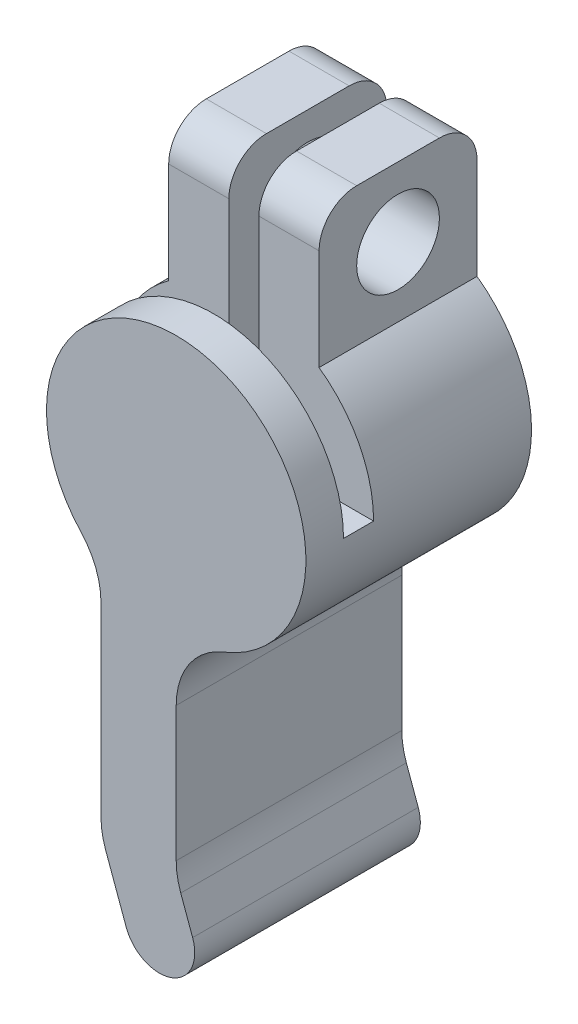
ISO-10303-21;
HEADER;
FILE_DESCRIPTION(('STEP AP214'),'2;1');
FILE_NAME('part.step','',(''),(''),'','','');
FILE_SCHEMA(('AUTOMOTIVE_DESIGN { 1 0 10303 214 1 1 1 1 }'));
ENDSEC;
DATA;
#1=APPLICATION_CONTEXT('core data for automotive mechanical design processes');
#2=APPLICATION_PROTOCOL_DEFINITION('international standard','automotive_design',2000,#1);
#3=PRODUCT_CONTEXT('',#1,'mechanical');
#4=PRODUCT('Part','Part','',(#3));
#5=PRODUCT_RELATED_PRODUCT_CATEGORY('part','',(#4));
#6=PRODUCT_DEFINITION_FORMATION('','',#4);
#7=PRODUCT_DEFINITION_CONTEXT('part definition',#1,'design');
#8=PRODUCT_DEFINITION('design','',#6,#7);
#9=PRODUCT_DEFINITION_SHAPE('','',#8);
#10=(LENGTH_UNIT() NAMED_UNIT(*) SI_UNIT(.MILLI.,.METRE.));
#11=(NAMED_UNIT(*) PLANE_ANGLE_UNIT() SI_UNIT($,.RADIAN.));
#12=(NAMED_UNIT(*) SI_UNIT($,.STERADIAN.) SOLID_ANGLE_UNIT());
#13=UNCERTAINTY_MEASURE_WITH_UNIT(LENGTH_MEASURE(1.E-05),#10,'distance_accuracy_value','');
#14=(GEOMETRIC_REPRESENTATION_CONTEXT(3) GLOBAL_UNCERTAINTY_ASSIGNED_CONTEXT((#13)) GLOBAL_UNIT_ASSIGNED_CONTEXT((#10,
#11,#12)) REPRESENTATION_CONTEXT('',''));
#15=CARTESIAN_POINT('',(0.,0.,0.));
#16=DIRECTION('',(0.,0.,1.));
#17=DIRECTION('',(1.,0.,0.));
#18=AXIS2_PLACEMENT_3D('',#15,#16,#17);
#19=CARTESIAN_POINT('',(0.,0.,4.2));
#20=DIRECTION('',(0.,0.,1.));
#21=DIRECTION('',(1.,0.,0.));
#22=AXIS2_PLACEMENT_3D('',#19,#20,#21);
#23=PLANE('',#22);
#24=DIRECTION('',(1.,0.,0.));
#25=VECTOR('',#24,1.);
#26=CARTESIAN_POINT('',(0.,0.,4.2));
#27=LINE('',#26,#25);
#28=CARTESIAN_POINT('',(1.45,0.,4.2));
#29=VERTEX_POINT('',#28);
#30=CARTESIAN_POINT('',(3.45,0.,4.2));
#31=VERTEX_POINT('',#30);
#32=EDGE_CURVE('E249',#29,#31,#27,.T.);
#33=ORIENTED_EDGE('',*,*,#32,.T.);
#34=CARTESIAN_POINT('',(0.,0.,4.2));
#35=DIRECTION('',(0.,0.,1.));
#36=DIRECTION('',(1.,0.,0.));
#37=AXIS2_PLACEMENT_3D('',#34,#35,#36);
#38=CIRCLE('',#37,3.45);
#39=CARTESIAN_POINT('',(2.,2.81113855937412,4.2));
#40=VERTEX_POINT('',#39);
#41=EDGE_CURVE('E294',#31,#40,#38,.T.);
#42=ORIENTED_EDGE('',*,*,#41,.T.);
#43=DIRECTION('',(0.,-1.,0.));
#44=VECTOR('',#43,1.);
#45=CARTESIAN_POINT('',(2.,0.,4.2));
#46=LINE('',#45,#44);
#47=CARTESIAN_POINT('',(2.,5.5,4.2));
#48=VERTEX_POINT('',#47);
#49=EDGE_CURVE('E296',#48,#40,#46,.T.);
#50=ORIENTED_EDGE('',*,*,#49,.F.);
#51=DIRECTION('',(1.,0.,0.));
#52=VECTOR('',#51,1.);
#53=CARTESIAN_POINT('',(0.,5.5,4.2));
#54=LINE('',#53,#52);
#55=CARTESIAN_POINT('',(0.4,5.5,4.2));
#56=VERTEX_POINT('',#55);
#57=EDGE_CURVE('E372',#48,#56,#54,.F.);
#58=ORIENTED_EDGE('',*,*,#57,.T.);
#59=DIRECTION('',(0.,1.,0.));
#60=VECTOR('',#59,1.);
#61=CARTESIAN_POINT('',(0.400000000000001,0.,4.2));
#62=LINE('',#61,#60);
#63=CARTESIAN_POINT('',(0.4,1.39373598647664,4.2));
#64=VERTEX_POINT('',#63);
#65=EDGE_CURVE('E299',#64,#56,#62,.T.);
#66=ORIENTED_EDGE('',*,*,#65,.F.);
#67=CARTESIAN_POINT('',(0.,0.,4.2));
#68=DIRECTION('',(0.,0.,1.));
#69=DIRECTION('',(1.,0.,0.));
#70=AXIS2_PLACEMENT_3D('',#67,#68,#69);
#71=CIRCLE('',#70,1.45);
#72=EDGE_CURVE('E302',#29,#64,#71,.T.);
#73=ORIENTED_EDGE('',*,*,#72,.F.);
#74=EDGE_LOOP('',(#33,#42,#50,#58,#66,#73));
#75=FACE_BOUND('',#74,.T.);
#76=ADVANCED_FACE('F42',(#75),#23,.T.);
#77=CARTESIAN_POINT('',(-2.,0.,4.2));
#78=DIRECTION('',(1.,0.,0.));
#79=DIRECTION('',(0.,1.,0.));
#80=AXIS2_PLACEMENT_3D('',#77,#78,#79);
#81=PLANE('',#80);
#82=CARTESIAN_POINT('',(-2.,4.65556927968706,2.1));
#83=DIRECTION('',(-1.,0.,0.));
#84=DIRECTION('',(0.,-1.,0.));
#85=AXIS2_PLACEMENT_3D('',#82,#83,#84);
#86=CIRCLE('',#85,1.1);
#87=CARTESIAN_POINT('',(-2.,3.55556927968706,2.1));
#88=VERTEX_POINT('',#87);
#89=EDGE_CURVE('E278',#88,#88,#86,.T.);
#90=ORIENTED_EDGE('',*,*,#89,.F.);
#91=EDGE_LOOP('',(#90));
#92=FACE_BOUND('',#91,.T.);
#93=DIRECTION('',(0.,-1.,0.));
#94=VECTOR('',#93,1.);
#95=CARTESIAN_POINT('',(-2.,0.,4.2));
#96=LINE('',#95,#94);
#97=CARTESIAN_POINT('',(-2.,5.5,4.2));
#98=VERTEX_POINT('',#97);
#99=CARTESIAN_POINT('',(-2.,2.81113855937412,4.2));
#100=VERTEX_POINT('',#99);
#101=EDGE_CURVE('E289',#98,#100,#96,.T.);
#102=ORIENTED_EDGE('',*,*,#101,.F.);
#103=CARTESIAN_POINT('',(-2.,5.5,3.2));
#104=DIRECTION('',(1.,0.,0.));
#105=DIRECTION('',(0.,1.,0.));
#106=AXIS2_PLACEMENT_3D('',#103,#104,#105);
#107=CIRCLE('',#106,1.);
#108=CARTESIAN_POINT('',(-2.,6.5,3.2));
#109=VERTEX_POINT('',#108);
#110=EDGE_CURVE('E385',#98,#109,#107,.F.);
#111=ORIENTED_EDGE('',*,*,#110,.T.);
#112=DIRECTION('',(0.,0.,-1.));
#113=VECTOR('',#112,1.);
#114=CARTESIAN_POINT('',(-2.,6.5,4.2));
#115=LINE('',#114,#113);
#116=CARTESIAN_POINT('',(-2.,6.5,1.));
#117=VERTEX_POINT('',#116);
#118=EDGE_CURVE('E309',#109,#117,#115,.T.);
#119=ORIENTED_EDGE('',*,*,#118,.T.);
#120=CARTESIAN_POINT('',(-2.,5.5,1.));
#121=DIRECTION('',(1.,0.,0.));
#122=DIRECTION('',(0.,1.,0.));
#123=AXIS2_PLACEMENT_3D('',#120,#121,#122);
#124=CIRCLE('',#123,1.);
#125=CARTESIAN_POINT('',(-2.,5.5,0.));
#126=VERTEX_POINT('',#125);
#127=EDGE_CURVE('E383',#117,#126,#124,.F.);
#128=ORIENTED_EDGE('',*,*,#127,.T.);
#129=DIRECTION('',(0.,-1.,0.));
#130=VECTOR('',#129,1.);
#131=CARTESIAN_POINT('',(-2.,0.,0.));
#132=LINE('',#131,#130);
#133=CARTESIAN_POINT('',(-2.,2.81113855937412,0.));
#134=VERTEX_POINT('',#133);
#135=EDGE_CURVE('E288',#126,#134,#132,.T.);
#136=ORIENTED_EDGE('',*,*,#135,.T.);
#137=DIRECTION('',(0.,0.,-1.));
#138=VECTOR('',#137,1.);
#139=CARTESIAN_POINT('',(-2.,2.81113855937412,4.2));
#140=LINE('',#139,#138);
#141=EDGE_CURVE('E237',#100,#134,#140,.T.);
#142=ORIENTED_EDGE('',*,*,#141,.F.);
#143=EDGE_LOOP('',(#102,#111,#119,#128,#136,#142));
#144=FACE_BOUND('',#143,.T.);
#145=ADVANCED_FACE('F506',(#92,#144),#81,.F.);
#146=CARTESIAN_POINT('',(-2.,0.,4.2));
#147=DIRECTION('',(-1.,0.,0.));
#148=DIRECTION('',(0.,0.,1.));
#149=AXIS2_PLACEMENT_3D('',#146,#147,#148);
#150=PLANE('',#149);
#151=DIRECTION('',(0.,1.,0.));
#152=VECTOR('',#151,1.);
#153=CARTESIAN_POINT('',(-2.,0.,0.));
#154=LINE('',#153,#152);
#155=CARTESIAN_POINT('',(-2.,-8.64734603858308,0.));
#156=VERTEX_POINT('',#155);
#157=CARTESIAN_POINT('',(-2.,-3.70168880377592,0.));
#158=VERTEX_POINT('',#157);
#159=EDGE_CURVE('E314',#156,#158,#154,.T.);
#160=ORIENTED_EDGE('',*,*,#159,.F.);
#161=DIRECTION('',(0.,0.,-1.));
#162=VECTOR('',#161,1.);
#163=CARTESIAN_POINT('',(-2.,-8.64734603858308,4.2));
#164=LINE('',#163,#162);
#165=CARTESIAN_POINT('',(-2.,-8.64734603858308,6.));
#166=VERTEX_POINT('',#165);
#167=EDGE_CURVE('E403',#156,#166,#164,.F.);
#168=ORIENTED_EDGE('',*,*,#167,.T.);
#169=DIRECTION('',(0.,-1.,0.));
#170=VECTOR('',#169,1.);
#171=CARTESIAN_POINT('',(-2.,0.,6.));
#172=LINE('',#171,#170);
#173=CARTESIAN_POINT('',(-2.,-3.70168880377592,6.));
#174=VERTEX_POINT('',#173);
#175=EDGE_CURVE('E227',#174,#166,#172,.T.);
#176=ORIENTED_EDGE('',*,*,#175,.F.);
#177=DIRECTION('',(0.,0.,-1.));
#178=VECTOR('',#177,1.);
#179=CARTESIAN_POINT('',(-2.,-3.70168880377592,4.2));
#180=LINE('',#179,#178);
#181=EDGE_CURVE('E400',#174,#158,#180,.T.);
#182=ORIENTED_EDGE('',*,*,#181,.T.);
#183=EDGE_LOOP('',(#160,#168,#176,#182));
#184=FACE_BOUND('',#183,.T.);
#185=ADVANCED_FACE('F440',(#184),#150,.T.);
#186=CARTESIAN_POINT('',(-4.65858868670837,-1.69558761565109,4.2));
#187=DIRECTION('',(-0.939692620785911,-0.342020143325663,0.));
#188=DIRECTION('',(0.342020143325663,-0.939692620785911,0.));
#189=AXIS2_PLACEMENT_3D('',#186,#187,#188);
#190=PLANE('',#189);
#191=DIRECTION('',(0.342020143325663,-0.939692620785911,0.));
#192=VECTOR('',#191,1.);
#193=CARTESIAN_POINT('',(-4.65858868670837,-1.69558761565109,6.));
#194=LINE('',#193,#192);
#195=CARTESIAN_POINT('',(-1.87938524157182,-9.3313863252344,6.));
#196=VERTEX_POINT('',#195);
#197=CARTESIAN_POINT('',(-1.32928016199955,-10.8427876096865,6.));
#198=VERTEX_POINT('',#197);
#199=EDGE_CURVE('E215',#196,#198,#194,.T.);
#200=ORIENTED_EDGE('',*,*,#199,.F.);
#201=DIRECTION('',(0.,0.,-1.));
#202=VECTOR('',#201,1.);
#203=CARTESIAN_POINT('',(-1.87938524157182,-9.3313863252344,4.2));
#204=LINE('',#203,#202);
#205=CARTESIAN_POINT('',(-1.87938524157182,-9.3313863252344,0.));
#206=VERTEX_POINT('',#205);
#207=EDGE_CURVE('E396',#196,#206,#204,.T.);
#208=ORIENTED_EDGE('',*,*,#207,.T.);
#209=DIRECTION('',(-0.342020143325663,0.939692620785911,0.));
#210=VECTOR('',#209,1.);
#211=CARTESIAN_POINT('',(-4.65858868670837,-1.69558761565109,0.));
#212=LINE('',#211,#210);
#213=CARTESIAN_POINT('',(-1.32928016199955,-10.8427876096865,0.));
#214=VERTEX_POINT('',#213);
#215=EDGE_CURVE('E233',#214,#206,#212,.T.);
#216=ORIENTED_EDGE('',*,*,#215,.F.);
#217=DIRECTION('',(0.,0.,-1.));
#218=VECTOR('',#217,1.);
#219=CARTESIAN_POINT('',(-1.32928016199955,-10.8427876096865,4.2));
#220=LINE('',#219,#218);
#221=EDGE_CURVE('E230',#198,#214,#220,.T.);
#222=ORIENTED_EDGE('',*,*,#221,.F.);
#223=EDGE_LOOP('',(#200,#208,#216,#222));
#224=FACE_BOUND('',#223,.T.);
#225=ADVANCED_FACE('F231',(#224),#190,.T.);
#226=CARTESIAN_POINT('',(-0.446257940440058,-10.5213938048433,4.2));
#227=DIRECTION('',(0.,0.,-1.));
#228=DIRECTION('',(-1.,0.,0.));
#229=AXIS2_PLACEMENT_3D('',#226,#227,#228);
#230=CYLINDRICAL_SURFACE('',#229,0.939692620785911);
#231=CARTESIAN_POINT('',(-0.446257940440058,-10.5213938048433,0.));
#232=DIRECTION('',(0.,0.,1.));
#233=DIRECTION('',(1.,0.,0.));
#234=AXIS2_PLACEMENT_3D('',#231,#232,#233);
#235=CIRCLE('',#234,0.939692620785911);
#236=CARTESIAN_POINT('',(0.436764281119435,-10.2,0.));
#237=VERTEX_POINT('',#236);
#238=EDGE_CURVE('E318',#214,#237,#235,.T.);
#239=ORIENTED_EDGE('',*,*,#238,.T.);
#240=DIRECTION('',(0.,0.,-1.));
#241=VECTOR('',#240,1.);
#242=CARTESIAN_POINT('',(0.436764281119435,-10.2,4.2));
#243=LINE('',#242,#241);
#244=CARTESIAN_POINT('',(0.436764281119435,-10.2,6.));
#245=VERTEX_POINT('',#244);
#246=EDGE_CURVE('E238',#245,#237,#243,.T.);
#247=ORIENTED_EDGE('',*,*,#246,.F.);
#248=CARTESIAN_POINT('',(-0.446257940440058,-10.5213938048433,6.));
#249=DIRECTION('',(0.,0.,1.));
#250=DIRECTION('',(1.,0.,0.));
#251=AXIS2_PLACEMENT_3D('',#248,#249,#250);
#252=CIRCLE('',#251,0.939692620785911);
#253=EDGE_CURVE('E220',#198,#245,#252,.T.);
#254=ORIENTED_EDGE('',*,*,#253,.F.);
#255=ORIENTED_EDGE('',*,*,#221,.T.);
#256=EDGE_LOOP('',(#239,#247,#254,#255));
#257=FACE_BOUND('',#256,.T.);
#258=ADVANCED_FACE('F240',(#257),#230,.T.);
#259=CARTESIAN_POINT('',(-2.89254424358938,-1.05280000596456,4.2));
#260=DIRECTION('',(0.939692620785911,0.342020143325663,0.));
#261=DIRECTION('',(-0.342020143325663,0.939692620785911,0.));
#262=AXIS2_PLACEMENT_3D('',#259,#260,#261);
#263=PLANE('',#262);
#264=DIRECTION('',(0.342020143325663,-0.939692620785911,0.));
#265=VECTOR('',#264,1.);
#266=CARTESIAN_POINT('',(-2.89254424358938,-1.05280000596456,0.));
#267=LINE('',#266,#265);
#268=CARTESIAN_POINT('',(0.120614758428179,-9.3313863252344,0.));
#269=VERTEX_POINT('',#268);
#270=EDGE_CURVE('E320',#269,#237,#267,.T.);
#271=ORIENTED_EDGE('',*,*,#270,.F.);
#272=DIRECTION('',(0.,0.,-1.));
#273=VECTOR('',#272,1.);
#274=CARTESIAN_POINT('',(0.120614758428179,-9.3313863252344,4.2));
#275=LINE('',#274,#273);
#276=CARTESIAN_POINT('',(0.120614758428179,-9.3313863252344,6.));
#277=VERTEX_POINT('',#276);
#278=EDGE_CURVE('E410',#269,#277,#275,.F.);
#279=ORIENTED_EDGE('',*,*,#278,.T.);
#280=DIRECTION('',(-0.342020143325663,0.939692620785911,0.));
#281=VECTOR('',#280,1.);
#282=CARTESIAN_POINT('',(-2.89254424358938,-1.05280000596456,6.));
#283=LINE('',#282,#281);
#284=EDGE_CURVE('E242',#245,#277,#283,.T.);
#285=ORIENTED_EDGE('',*,*,#284,.F.);
#286=ORIENTED_EDGE('',*,*,#246,.T.);
#287=EDGE_LOOP('',(#271,#279,#285,#286));
#288=FACE_BOUND('',#287,.T.);
#289=ADVANCED_FACE('F449',(#288),#263,.T.);
#290=CARTESIAN_POINT('',(0.,0.,4.2));
#291=DIRECTION('',(-1.,0.,0.));
#292=DIRECTION('',(0.,0.,1.));
#293=AXIS2_PLACEMENT_3D('',#290,#291,#292);
#294=PLANE('',#293);
#295=DIRECTION('',(0.,1.,0.));
#296=VECTOR('',#295,1.);
#297=CARTESIAN_POINT('',(0.,0.,6.));
#298=LINE('',#297,#296);
#299=CARTESIAN_POINT('',(0.,-8.64734603858307,6.));
#300=VERTEX_POINT('',#299);
#301=CARTESIAN_POINT('',(0.,-5.06976330808451,6.));
#302=VERTEX_POINT('',#301);
#303=EDGE_CURVE('E244',#300,#302,#298,.T.);
#304=ORIENTED_EDGE('',*,*,#303,.F.);
#305=DIRECTION('',(0.,0.,-1.));
#306=VECTOR('',#305,1.);
#307=CARTESIAN_POINT('',(0.,-8.64734603858307,4.2));
#308=LINE('',#307,#306);
#309=CARTESIAN_POINT('',(0.,-8.64734603858307,0.));
#310=VERTEX_POINT('',#309);
#311=EDGE_CURVE('E407',#300,#310,#308,.T.);
#312=ORIENTED_EDGE('',*,*,#311,.T.);
#313=DIRECTION('',(0.,1.,0.));
#314=VECTOR('',#313,1.);
#315=CARTESIAN_POINT('',(0.,0.,0.));
#316=LINE('',#315,#314);
#317=CARTESIAN_POINT('',(0.,-5.06976330808451,0.));
#318=VERTEX_POINT('',#317);
#319=EDGE_CURVE('E322',#310,#318,#316,.T.);
#320=ORIENTED_EDGE('',*,*,#319,.T.);
#321=DIRECTION('',(0.,0.,1.));
#322=VECTOR('',#321,1.);
#323=CARTESIAN_POINT('',(0.,-5.06976330808451,6.));
#324=LINE('',#323,#322);
#325=EDGE_CURVE('E57',#318,#302,#324,.T.);
#326=ORIENTED_EDGE('',*,*,#325,.T.);
#327=EDGE_LOOP('',(#304,#312,#320,#326));
#328=FACE_BOUND('',#327,.T.);
#329=ADVANCED_FACE('F453',(#328),#294,.F.);
#330=CARTESIAN_POINT('',(0.,0.,4.2));
#331=DIRECTION('',(0.,0.,-1.));
#332=DIRECTION('',(-1.,0.,0.));
#333=AXIS2_PLACEMENT_3D('',#330,#331,#332);
#334=CYLINDRICAL_SURFACE('',#333,3.45);
#335=CARTESIAN_POINT('',(0.,0.,6.));
#336=DIRECTION('',(0.,0.,1.));
#337=DIRECTION('',(1.,0.,0.));
#338=AXIS2_PLACEMENT_3D('',#335,#336,#337);
#339=CIRCLE('',#338,3.45);
#340=CARTESIAN_POINT('',(1.26605504587156,-3.20929970878744,6.));
#341=VERTEX_POINT('',#340);
#342=CARTESIAN_POINT('',(-2.53211009174312,-2.34327089413338,6.));
#343=VERTEX_POINT('',#342);
#344=EDGE_CURVE('E253',#341,#343,#339,.T.);
#345=ORIENTED_EDGE('',*,*,#344,.F.);
#346=DIRECTION('',(0.,0.,-1.));
#347=VECTOR('',#346,1.);
#348=CARTESIAN_POINT('',(1.26605504587156,-3.20929970878744,4.2));
#349=LINE('',#348,#347);
#350=CARTESIAN_POINT('',(1.26605504587156,-3.20929970878744,0.));
#351=VERTEX_POINT('',#350);
#352=EDGE_CURVE('E414',#341,#351,#349,.T.);
#353=ORIENTED_EDGE('',*,*,#352,.T.);
#354=CARTESIAN_POINT('',(0.,0.,0.));
#355=DIRECTION('',(0.,0.,1.));
#356=DIRECTION('',(1.,0.,0.));
#357=AXIS2_PLACEMENT_3D('',#354,#355,#356);
#358=CIRCLE('',#357,3.45);
#359=CARTESIAN_POINT('',(2.,2.81113855937412,0.));
#360=VERTEX_POINT('',#359);
#361=EDGE_CURVE('E324',#351,#360,#358,.T.);
#362=ORIENTED_EDGE('',*,*,#361,.T.);
#363=DIRECTION('',(0.,0.,-1.));
#364=VECTOR('',#363,1.);
#365=CARTESIAN_POINT('',(2.,2.81113855937412,4.2));
#366=LINE('',#365,#364);
#367=EDGE_CURVE('E352',#40,#360,#366,.T.);
#368=ORIENTED_EDGE('',*,*,#367,.F.);
#369=ORIENTED_EDGE('',*,*,#41,.F.);
#370=DIRECTION('',(0.,0.,-1.));
#371=VECTOR('',#370,1.);
#372=CARTESIAN_POINT('',(3.45,0.,5.));
#373=LINE('',#372,#371);
#374=CARTESIAN_POINT('',(3.45,0.,5.));
#375=VERTEX_POINT('',#374);
#376=EDGE_CURVE('E263',#375,#31,#373,.T.);
#377=ORIENTED_EDGE('',*,*,#376,.F.);
#378=CARTESIAN_POINT('',(0.,0.,5.));
#379=DIRECTION('',(0.,0.,1.));
#380=DIRECTION('',(1.,0.,0.));
#381=AXIS2_PLACEMENT_3D('',#378,#379,#380);
#382=CIRCLE('',#381,3.45);
#383=CARTESIAN_POINT('',(-3.45,0.,5.));
#384=VERTEX_POINT('',#383);
#385=EDGE_CURVE('E250',#375,#384,#382,.T.);
#386=ORIENTED_EDGE('',*,*,#385,.T.);
#387=DIRECTION('',(0.,0.,-1.));
#388=VECTOR('',#387,1.);
#389=CARTESIAN_POINT('',(-3.45,0.,5.));
#390=LINE('',#389,#388);
#391=CARTESIAN_POINT('',(-3.45,0.,4.2));
#392=VERTEX_POINT('',#391);
#393=EDGE_CURVE('E269',#384,#392,#390,.T.);
#394=ORIENTED_EDGE('',*,*,#393,.T.);
#395=CARTESIAN_POINT('',(0.,0.,4.2));
#396=DIRECTION('',(0.,0.,1.));
#397=DIRECTION('',(1.,0.,0.));
#398=AXIS2_PLACEMENT_3D('',#395,#396,#397);
#399=CIRCLE('',#398,3.45);
#400=EDGE_CURVE('E291',#100,#392,#399,.T.);
#401=ORIENTED_EDGE('',*,*,#400,.F.);
#402=ORIENTED_EDGE('',*,*,#141,.T.);
#403=CARTESIAN_POINT('',(0.,0.,0.));
#404=DIRECTION('',(0.,0.,1.));
#405=DIRECTION('',(1.,0.,0.));
#406=AXIS2_PLACEMENT_3D('',#403,#404,#405);
#407=CIRCLE('',#406,3.45);
#408=CARTESIAN_POINT('',(-2.53211009174312,-2.34327089413338,0.));
#409=VERTEX_POINT('',#408);
#410=EDGE_CURVE('E311',#134,#409,#407,.T.);
#411=ORIENTED_EDGE('',*,*,#410,.T.);
#412=DIRECTION('',(0.,0.,-1.));
#413=VECTOR('',#412,1.);
#414=CARTESIAN_POINT('',(-2.53211009174312,-2.34327089413338,4.2));
#415=LINE('',#414,#413);
#416=EDGE_CURVE('E412',#409,#343,#415,.F.);
#417=ORIENTED_EDGE('',*,*,#416,.T.);
#418=EDGE_LOOP('',(#345,#353,#362,#368,#369,#377,#386,#394,#401,#402,#411,#417));
#419=FACE_BOUND('',#418,.T.);
#420=ADVANCED_FACE('F433',(#419),#334,.T.);
#421=CARTESIAN_POINT('',(2.,0.,4.2));
#422=DIRECTION('',(1.,0.,0.));
#423=DIRECTION('',(0.,1.,0.));
#424=AXIS2_PLACEMENT_3D('',#421,#422,#423);
#425=PLANE('',#424);
#426=CARTESIAN_POINT('',(2.,4.65556927968706,2.1));
#427=DIRECTION('',(1.,0.,0.));
#428=DIRECTION('',(0.,1.,0.));
#429=AXIS2_PLACEMENT_3D('',#426,#427,#428);
#430=CIRCLE('',#429,1.1);
#431=CARTESIAN_POINT('',(2.,5.75556927968706,2.1));
#432=VERTEX_POINT('',#431);
#433=EDGE_CURVE('E285',#432,#432,#430,.T.);
#434=ORIENTED_EDGE('',*,*,#433,.F.);
#435=EDGE_LOOP('',(#434));
#436=FACE_BOUND('',#435,.T.);
#437=DIRECTION('',(0.,0.,-1.));
#438=VECTOR('',#437,1.);
#439=CARTESIAN_POINT('',(2.,6.5,4.2));
#440=LINE('',#439,#438);
#441=CARTESIAN_POINT('',(2.,6.5,3.2));
#442=VERTEX_POINT('',#441);
#443=CARTESIAN_POINT('',(2.,6.5,1.));
#444=VERTEX_POINT('',#443);
#445=EDGE_CURVE('E349',#442,#444,#440,.T.);
#446=ORIENTED_EDGE('',*,*,#445,.F.);
#447=CARTESIAN_POINT('',(2.,5.5,3.2));
#448=DIRECTION('',(1.,0.,0.));
#449=DIRECTION('',(0.,1.,0.));
#450=AXIS2_PLACEMENT_3D('',#447,#448,#449);
#451=CIRCLE('',#450,1.);
#452=EDGE_CURVE('E367',#442,#48,#451,.T.);
#453=ORIENTED_EDGE('',*,*,#452,.T.);
#454=ORIENTED_EDGE('',*,*,#49,.T.);
#455=ORIENTED_EDGE('',*,*,#367,.T.);
#456=DIRECTION('',(0.,-1.,0.));
#457=VECTOR('',#456,1.);
#458=CARTESIAN_POINT('',(2.,0.,0.));
#459=LINE('',#458,#457);
#460=CARTESIAN_POINT('',(2.,5.5,0.));
#461=VERTEX_POINT('',#460);
#462=EDGE_CURVE('E326',#461,#360,#459,.T.);
#463=ORIENTED_EDGE('',*,*,#462,.F.);
#464=CARTESIAN_POINT('',(2.,5.5,1.));
#465=DIRECTION('',(1.,0.,0.));
#466=DIRECTION('',(0.,1.,0.));
#467=AXIS2_PLACEMENT_3D('',#464,#465,#466);
#468=CIRCLE('',#467,1.);
#469=EDGE_CURVE('E365',#461,#444,#468,.T.);
#470=ORIENTED_EDGE('',*,*,#469,.T.);
#471=EDGE_LOOP('',(#446,#453,#454,#455,#463,#470));
#472=FACE_BOUND('',#471,.T.);
#473=ADVANCED_FACE('F464',(#436,#472),#425,.T.);
#474=CARTESIAN_POINT('',(0.,6.5,4.2));
#475=DIRECTION('',(0.,1.,0.));
#476=DIRECTION('',(0.,0.,1.));
#477=AXIS2_PLACEMENT_3D('',#474,#475,#476);
#478=PLANE('',#477);
#479=DIRECTION('',(0.,0.,-1.));
#480=VECTOR('',#479,1.);
#481=CARTESIAN_POINT('',(0.4,6.5,4.2));
#482=LINE('',#481,#480);
#483=CARTESIAN_POINT('',(0.4,6.5,3.2));
#484=VERTEX_POINT('',#483);
#485=CARTESIAN_POINT('',(0.4,6.5,1.));
#486=VERTEX_POINT('',#485);
#487=EDGE_CURVE('E346',#484,#486,#482,.T.);
#488=ORIENTED_EDGE('',*,*,#487,.F.);
#489=DIRECTION('',(1.,0.,0.));
#490=VECTOR('',#489,1.);
#491=CARTESIAN_POINT('',(0.,6.5,3.2));
#492=LINE('',#491,#490);
#493=EDGE_CURVE('E362',#484,#442,#492,.T.);
#494=ORIENTED_EDGE('',*,*,#493,.T.);
#495=ORIENTED_EDGE('',*,*,#445,.T.);
#496=DIRECTION('',(1.,0.,0.));
#497=VECTOR('',#496,1.);
#498=CARTESIAN_POINT('',(0.4,6.5,1.));
#499=LINE('',#498,#497);
#500=EDGE_CURVE('E358',#444,#486,#499,.F.);
#501=ORIENTED_EDGE('',*,*,#500,.T.);
#502=EDGE_LOOP('',(#488,#494,#495,#501));
#503=FACE_BOUND('',#502,.T.);
#504=ADVANCED_FACE('F479',(#503),#478,.T.);
#505=CARTESIAN_POINT('',(0.400000000000001,0.,4.2));
#506=DIRECTION('',(-1.,0.,0.));
#507=DIRECTION('',(0.,-1.,0.));
#508=AXIS2_PLACEMENT_3D('',#505,#506,#507);
#509=PLANE('',#508);
#510=CARTESIAN_POINT('',(0.4,4.65556927968706,2.1));
#511=DIRECTION('',(-1.,0.,0.));
#512=DIRECTION('',(0.,-1.,0.));
#513=AXIS2_PLACEMENT_3D('',#510,#511,#512);
#514=CIRCLE('',#513,1.1);
#515=CARTESIAN_POINT('',(0.4,3.55556927968706,2.1));
#516=VERTEX_POINT('',#515);
#517=EDGE_CURVE('E282',#516,#516,#514,.T.);
#518=ORIENTED_EDGE('',*,*,#517,.F.);
#519=EDGE_LOOP('',(#518));
#520=FACE_BOUND('',#519,.T.);
#521=ORIENTED_EDGE('',*,*,#65,.T.);
#522=CARTESIAN_POINT('',(0.4,5.5,3.2));
#523=DIRECTION('',(-1.,0.,0.));
#524=DIRECTION('',(0.,-1.,0.));
#525=AXIS2_PLACEMENT_3D('',#522,#523,#524);
#526=CIRCLE('',#525,1.);
#527=EDGE_CURVE('E376',#56,#484,#526,.T.);
#528=ORIENTED_EDGE('',*,*,#527,.T.);
#529=ORIENTED_EDGE('',*,*,#487,.T.);
#530=CARTESIAN_POINT('',(0.4,5.5,1.));
#531=DIRECTION('',(-1.,0.,0.));
#532=DIRECTION('',(0.,-1.,0.));
#533=AXIS2_PLACEMENT_3D('',#530,#531,#532);
#534=CIRCLE('',#533,1.);
#535=CARTESIAN_POINT('',(0.4,5.5,0.));
#536=VERTEX_POINT('',#535);
#537=EDGE_CURVE('E374',#486,#536,#534,.T.);
#538=ORIENTED_EDGE('',*,*,#537,.T.);
#539=DIRECTION('',(0.,1.,0.));
#540=VECTOR('',#539,1.);
#541=CARTESIAN_POINT('',(0.400000000000001,0.,0.));
#542=LINE('',#541,#540);
#543=CARTESIAN_POINT('',(0.4,1.39373598647664,0.));
#544=VERTEX_POINT('',#543);
#545=EDGE_CURVE('E329',#544,#536,#542,.T.);
#546=ORIENTED_EDGE('',*,*,#545,.F.);
#547=DIRECTION('',(0.,0.,-1.));
#548=VECTOR('',#547,1.);
#549=CARTESIAN_POINT('',(0.4,1.39373598647664,4.2));
#550=LINE('',#549,#548);
#551=EDGE_CURVE('E344',#64,#544,#550,.T.);
#552=ORIENTED_EDGE('',*,*,#551,.F.);
#553=EDGE_LOOP('',(#521,#528,#529,#538,#546,#552));
#554=FACE_BOUND('',#553,.T.);
#555=ADVANCED_FACE('F475',(#520,#554),#509,.T.);
#556=CARTESIAN_POINT('',(0.,0.,4.2));
#557=DIRECTION('',(0.,0.,-1.));
#558=DIRECTION('',(-1.,0.,0.));
#559=AXIS2_PLACEMENT_3D('',#556,#557,#558);
#560=CYLINDRICAL_SURFACE('',#559,1.45);
#561=CARTESIAN_POINT('',(0.,0.,0.));
#562=DIRECTION('',(0.,0.,1.));
#563=DIRECTION('',(1.,0.,0.));
#564=AXIS2_PLACEMENT_3D('',#561,#562,#563);
#565=CIRCLE('',#564,1.45);
#566=CARTESIAN_POINT('',(-0.4,1.39373598647664,0.));
#567=VERTEX_POINT('',#566);
#568=EDGE_CURVE('E332',#567,#544,#565,.T.);
#569=ORIENTED_EDGE('',*,*,#568,.F.);
#570=DIRECTION('',(0.,0.,-1.));
#571=VECTOR('',#570,1.);
#572=CARTESIAN_POINT('',(-0.4,1.39373598647664,4.2));
#573=LINE('',#572,#571);
#574=CARTESIAN_POINT('',(-0.4,1.39373598647664,4.2));
#575=VERTEX_POINT('',#574);
#576=EDGE_CURVE('E342',#575,#567,#573,.T.);
#577=ORIENTED_EDGE('',*,*,#576,.F.);
#578=CARTESIAN_POINT('',(-1.45,0.,4.2));
#579=VERTEX_POINT('',#578);
#580=EDGE_CURVE('E303',#575,#579,#71,.T.);
#581=ORIENTED_EDGE('',*,*,#580,.T.);
#582=DIRECTION('',(0.,0.,-1.));
#583=VECTOR('',#582,1.);
#584=CARTESIAN_POINT('',(-1.45,0.,5.));
#585=LINE('',#584,#583);
#586=CARTESIAN_POINT('',(-1.45,0.,5.));
#587=VERTEX_POINT('',#586);
#588=EDGE_CURVE('E272',#587,#579,#585,.T.);
#589=ORIENTED_EDGE('',*,*,#588,.F.);
#590=CARTESIAN_POINT('',(0.,0.,5.));
#591=DIRECTION('',(0.,0.,1.));
#592=DIRECTION('',(1.,0.,0.));
#593=AXIS2_PLACEMENT_3D('',#590,#591,#592);
#594=CIRCLE('',#593,1.45);
#595=CARTESIAN_POINT('',(1.45,0.,5.));
#596=VERTEX_POINT('',#595);
#597=EDGE_CURVE('E257',#596,#587,#594,.F.);
#598=ORIENTED_EDGE('',*,*,#597,.F.);
#599=DIRECTION('',(0.,0.,-1.));
#600=VECTOR('',#599,1.);
#601=CARTESIAN_POINT('',(1.45,0.,5.));
#602=LINE('',#601,#600);
#603=EDGE_CURVE('E275',#596,#29,#602,.T.);
#604=ORIENTED_EDGE('',*,*,#603,.T.);
#605=ORIENTED_EDGE('',*,*,#72,.T.);
#606=ORIENTED_EDGE('',*,*,#551,.T.);
#607=EDGE_LOOP('',(#569,#577,#581,#589,#598,#604,#605,#606));
#608=FACE_BOUND('',#607,.T.);
#609=ADVANCED_FACE('F487',(#608),#560,.F.);
#610=CARTESIAN_POINT('',(-0.399999999999999,0.,4.2));
#611=DIRECTION('',(-1.,0.,0.));
#612=DIRECTION('',(0.,-1.,0.));
#613=AXIS2_PLACEMENT_3D('',#610,#611,#612);
#614=PLANE('',#613);
#615=CARTESIAN_POINT('',(-0.4,4.65556927968706,2.1));
#616=DIRECTION('',(-1.,0.,0.));
#617=DIRECTION('',(0.,-1.,0.));
#618=AXIS2_PLACEMENT_3D('',#615,#616,#617);
#619=CIRCLE('',#618,1.1);
#620=CARTESIAN_POINT('',(-0.4,3.55556927968706,2.1));
#621=VERTEX_POINT('',#620);
#622=EDGE_CURVE('E281',#621,#621,#619,.T.);
#623=ORIENTED_EDGE('',*,*,#622,.T.);
#624=EDGE_LOOP('',(#623));
#625=FACE_BOUND('',#624,.T.);
#626=DIRECTION('',(0.,0.,-1.));
#627=VECTOR('',#626,1.);
#628=CARTESIAN_POINT('',(-0.4,6.5,4.2));
#629=LINE('',#628,#627);
#630=CARTESIAN_POINT('',(-0.4,6.5,3.2));
#631=VERTEX_POINT('',#630);
#632=CARTESIAN_POINT('',(-0.4,6.5,1.));
#633=VERTEX_POINT('',#632);
#634=EDGE_CURVE('E339',#631,#633,#629,.T.);
#635=ORIENTED_EDGE('',*,*,#634,.F.);
#636=CARTESIAN_POINT('',(-0.4,5.5,3.2));
#637=DIRECTION('',(-1.,0.,0.));
#638=DIRECTION('',(0.,-1.,0.));
#639=AXIS2_PLACEMENT_3D('',#636,#637,#638);
#640=CIRCLE('',#639,1.);
#641=CARTESIAN_POINT('',(-0.4,5.5,4.2));
#642=VERTEX_POINT('',#641);
#643=EDGE_CURVE('E394',#631,#642,#640,.F.);
#644=ORIENTED_EDGE('',*,*,#643,.T.);
#645=DIRECTION('',(0.,1.,0.));
#646=VECTOR('',#645,1.);
#647=CARTESIAN_POINT('',(-0.399999999999999,0.,4.2));
#648=LINE('',#647,#646);
#649=EDGE_CURVE('E306',#575,#642,#648,.T.);
#650=ORIENTED_EDGE('',*,*,#649,.F.);
#651=ORIENTED_EDGE('',*,*,#576,.T.);
#652=DIRECTION('',(0.,1.,0.));
#653=VECTOR('',#652,1.);
#654=CARTESIAN_POINT('',(-0.399999999999999,0.,0.));
#655=LINE('',#654,#653);
#656=CARTESIAN_POINT('',(-0.4,5.5,0.));
#657=VERTEX_POINT('',#656);
#658=EDGE_CURVE('E292',#567,#657,#655,.T.);
#659=ORIENTED_EDGE('',*,*,#658,.T.);
#660=CARTESIAN_POINT('',(-0.4,5.5,1.));
#661=DIRECTION('',(-1.,0.,0.));
#662=DIRECTION('',(0.,-1.,0.));
#663=AXIS2_PLACEMENT_3D('',#660,#661,#662);
#664=CIRCLE('',#663,1.);
#665=EDGE_CURVE('E392',#657,#633,#664,.F.);
#666=ORIENTED_EDGE('',*,*,#665,.T.);
#667=EDGE_LOOP('',(#635,#644,#650,#651,#659,#666));
#668=FACE_BOUND('',#667,.T.);
#669=ADVANCED_FACE('F514',(#625,#668),#614,.F.);
#670=CARTESIAN_POINT('',(0.,6.5,4.2));
#671=DIRECTION('',(0.,-1.,0.));
#672=DIRECTION('',(0.,0.,-1.));
#673=AXIS2_PLACEMENT_3D('',#670,#671,#672);
#674=PLANE('',#673);
#675=ORIENTED_EDGE('',*,*,#118,.F.);
#676=DIRECTION('',(-1.,0.,0.));
#677=VECTOR('',#676,1.);
#678=CARTESIAN_POINT('',(-0.4,6.5,3.2));
#679=LINE('',#678,#677);
#680=EDGE_CURVE('E390',#109,#631,#679,.F.);
#681=ORIENTED_EDGE('',*,*,#680,.T.);
#682=ORIENTED_EDGE('',*,*,#634,.T.);
#683=DIRECTION('',(-1.,0.,0.));
#684=VECTOR('',#683,1.);
#685=CARTESIAN_POINT('',(0.,6.5,1.));
#686=LINE('',#685,#684);
#687=EDGE_CURVE('E387',#633,#117,#686,.T.);
#688=ORIENTED_EDGE('',*,*,#687,.T.);
#689=EDGE_LOOP('',(#675,#681,#682,#688));
#690=FACE_BOUND('',#689,.T.);
#691=ADVANCED_FACE('F518',(#690),#674,.F.);
#692=DIRECTION('',(1.,0.,0.));
#693=VECTOR('',#692,1.);
#694=CARTESIAN_POINT('',(0.,0.,4.2));
#695=LINE('',#694,#693);
#696=EDGE_CURVE('E258',#392,#579,#695,.T.);
#697=ORIENTED_EDGE('',*,*,#696,.T.);
#698=ORIENTED_EDGE('',*,*,#580,.F.);
#699=ORIENTED_EDGE('',*,*,#649,.T.);
#700=DIRECTION('',(-1.,0.,0.));
#701=VECTOR('',#700,1.);
#702=CARTESIAN_POINT('',(-2.,5.5,4.2));
#703=LINE('',#702,#701);
#704=EDGE_CURVE('E369',#642,#98,#703,.T.);
#705=ORIENTED_EDGE('',*,*,#704,.T.);
#706=ORIENTED_EDGE('',*,*,#101,.T.);
#707=ORIENTED_EDGE('',*,*,#400,.T.);
#708=EDGE_LOOP('',(#697,#698,#699,#705,#706,#707));
#709=FACE_BOUND('',#708,.T.);
#710=ADVANCED_FACE('F503',(#709),#23,.T.);
#711=CARTESIAN_POINT('',(0.,0.,0.));
#712=DIRECTION('',(0.,0.,1.));
#713=DIRECTION('',(1.,0.,0.));
#714=AXIS2_PLACEMENT_3D('',#711,#712,#713);
#715=PLANE('',#714);
#716=ORIENTED_EDGE('',*,*,#215,.T.);
#717=CARTESIAN_POINT('',(0.,-8.64734603858308,0.));
#718=DIRECTION('',(0.,0.,1.));
#719=DIRECTION('',(1.,0.,0.));
#720=AXIS2_PLACEMENT_3D('',#717,#718,#719);
#721=CIRCLE('',#720,2.);
#722=EDGE_CURVE('E398',#206,#156,#721,.F.);
#723=ORIENTED_EDGE('',*,*,#722,.T.);
#724=ORIENTED_EDGE('',*,*,#159,.T.);
#725=CARTESIAN_POINT('',(-4.,-3.70168880377592,0.));
#726=DIRECTION('',(0.,0.,1.));
#727=DIRECTION('',(1.,0.,0.));
#728=AXIS2_PLACEMENT_3D('',#725,#726,#727);
#729=CIRCLE('',#728,2.);
#730=EDGE_CURVE('E50',#158,#409,#729,.T.);
#731=ORIENTED_EDGE('',*,*,#730,.T.);
#732=ORIENTED_EDGE('',*,*,#410,.F.);
#733=ORIENTED_EDGE('',*,*,#135,.F.);
#734=DIRECTION('',(-1.,0.,0.));
#735=VECTOR('',#734,1.);
#736=CARTESIAN_POINT('',(0.,5.5,0.));
#737=LINE('',#736,#735);
#738=EDGE_CURVE('E378',#126,#657,#737,.F.);
#739=ORIENTED_EDGE('',*,*,#738,.T.);
#740=ORIENTED_EDGE('',*,*,#658,.F.);
#741=ORIENTED_EDGE('',*,*,#568,.T.);
#742=ORIENTED_EDGE('',*,*,#545,.T.);
#743=DIRECTION('',(1.,0.,0.));
#744=VECTOR('',#743,1.);
#745=CARTESIAN_POINT('',(2.,5.5,0.));
#746=LINE('',#745,#744);
#747=EDGE_CURVE('E380',#536,#461,#746,.T.);
#748=ORIENTED_EDGE('',*,*,#747,.T.);
#749=ORIENTED_EDGE('',*,*,#462,.T.);
#750=ORIENTED_EDGE('',*,*,#361,.F.);
#751=CARTESIAN_POINT('',(2.,-5.06976330808451,0.));
#752=DIRECTION('',(0.,0.,1.));
#753=DIRECTION('',(1.,0.,0.));
#754=AXIS2_PLACEMENT_3D('',#751,#752,#753);
#755=CIRCLE('',#754,2.);
#756=EDGE_CURVE('E420',#351,#318,#755,.T.);
#757=ORIENTED_EDGE('',*,*,#756,.T.);
#758=ORIENTED_EDGE('',*,*,#319,.F.);
#759=CARTESIAN_POINT('',(2.,-8.64734603858307,0.));
#760=DIRECTION('',(0.,0.,1.));
#761=DIRECTION('',(1.,0.,0.));
#762=AXIS2_PLACEMENT_3D('',#759,#760,#761);
#763=CIRCLE('',#762,2.);
#764=EDGE_CURVE('E417',#310,#269,#763,.T.);
#765=ORIENTED_EDGE('',*,*,#764,.T.);
#766=ORIENTED_EDGE('',*,*,#270,.T.);
#767=ORIENTED_EDGE('',*,*,#238,.F.);
#768=EDGE_LOOP('',(#716,#723,#724,#731,#732,#733,#739,#740,#741,#742,#748,#749,#750,#757,#758,
#765,#766,#767));
#769=FACE_BOUND('',#768,.T.);
#770=ADVANCED_FACE('F425',(#769),#715,.F.);
#771=CARTESIAN_POINT('',(3.45,4.65556927968706,2.1));
#772=DIRECTION('',(-1.,0.,0.));
#773=DIRECTION('',(0.,-1.,0.));
#774=AXIS2_PLACEMENT_3D('',#771,#772,#773);
#775=CYLINDRICAL_SURFACE('',#774,1.1);
#776=ORIENTED_EDGE('',*,*,#89,.T.);
#777=EDGE_LOOP('',(#776));
#778=FACE_BOUND('',#777,.T.);
#779=ORIENTED_EDGE('',*,*,#622,.F.);
#780=EDGE_LOOP('',(#779));
#781=FACE_BOUND('',#780,.T.);
#782=ADVANCED_FACE('F545',(#778,#781),#775,.F.);
#783=ORIENTED_EDGE('',*,*,#433,.T.);
#784=EDGE_LOOP('',(#783));
#785=FACE_BOUND('',#784,.T.);
#786=ORIENTED_EDGE('',*,*,#517,.T.);
#787=EDGE_LOOP('',(#786));
#788=FACE_BOUND('',#787,.T.);
#789=ADVANCED_FACE('F576',(#785,#788),#775,.F.);
#790=CARTESIAN_POINT('',(0.,5.5,3.2));
#791=DIRECTION('',(1.,0.,0.));
#792=DIRECTION('',(0.,0.,-1.));
#793=AXIS2_PLACEMENT_3D('',#790,#791,#792);
#794=CYLINDRICAL_SURFACE('',#793,1.);
#795=ORIENTED_EDGE('',*,*,#527,.F.);
#796=ORIENTED_EDGE('',*,*,#57,.F.);
#797=ORIENTED_EDGE('',*,*,#452,.F.);
#798=ORIENTED_EDGE('',*,*,#493,.F.);
#799=EDGE_LOOP('',(#795,#796,#797,#798));
#800=FACE_BOUND('',#799,.T.);
#801=ADVANCED_FACE('F471',(#800),#794,.T.);
#802=CARTESIAN_POINT('',(0.,5.5,1.));
#803=DIRECTION('',(-1.,0.,0.));
#804=DIRECTION('',(0.,0.,1.));
#805=AXIS2_PLACEMENT_3D('',#802,#803,#804);
#806=CYLINDRICAL_SURFACE('',#805,1.);
#807=ORIENTED_EDGE('',*,*,#537,.F.);
#808=ORIENTED_EDGE('',*,*,#500,.F.);
#809=ORIENTED_EDGE('',*,*,#469,.F.);
#810=ORIENTED_EDGE('',*,*,#747,.F.);
#811=EDGE_LOOP('',(#807,#808,#809,#810));
#812=FACE_BOUND('',#811,.T.);
#813=ADVANCED_FACE('F482',(#812),#806,.T.);
#814=CARTESIAN_POINT('',(0.,5.5,3.2));
#815=DIRECTION('',(1.,0.,0.));
#816=DIRECTION('',(0.,0.,-1.));
#817=AXIS2_PLACEMENT_3D('',#814,#815,#816);
#818=CYLINDRICAL_SURFACE('',#817,1.);
#819=ORIENTED_EDGE('',*,*,#643,.F.);
#820=ORIENTED_EDGE('',*,*,#680,.F.);
#821=ORIENTED_EDGE('',*,*,#110,.F.);
#822=ORIENTED_EDGE('',*,*,#704,.F.);
#823=EDGE_LOOP('',(#819,#820,#821,#822));
#824=FACE_BOUND('',#823,.T.);
#825=ADVANCED_FACE('F521',(#824),#818,.T.);
#826=CARTESIAN_POINT('',(0.,5.5,1.));
#827=DIRECTION('',(-1.,0.,0.));
#828=DIRECTION('',(0.,0.,1.));
#829=AXIS2_PLACEMENT_3D('',#826,#827,#828);
#830=CYLINDRICAL_SURFACE('',#829,1.);
#831=ORIENTED_EDGE('',*,*,#665,.F.);
#832=ORIENTED_EDGE('',*,*,#738,.F.);
#833=ORIENTED_EDGE('',*,*,#127,.F.);
#834=ORIENTED_EDGE('',*,*,#687,.F.);
#835=EDGE_LOOP('',(#831,#832,#833,#834));
#836=FACE_BOUND('',#835,.T.);
#837=ADVANCED_FACE('F510',(#836),#830,.T.);
#838=CARTESIAN_POINT('',(0.,0.,5.));
#839=DIRECTION('',(0.,1.,0.));
#840=DIRECTION('',(-1.,0.,0.));
#841=AXIS2_PLACEMENT_3D('',#838,#839,#840);
#842=PLANE('',#841);
#843=ORIENTED_EDGE('',*,*,#32,.F.);
#844=ORIENTED_EDGE('',*,*,#603,.F.);
#845=DIRECTION('',(1.,0.,0.));
#846=VECTOR('',#845,1.);
#847=CARTESIAN_POINT('',(0.,0.,5.));
#848=LINE('',#847,#846);
#849=EDGE_CURVE('E254',#596,#375,#848,.T.);
#850=ORIENTED_EDGE('',*,*,#849,.T.);
#851=ORIENTED_EDGE('',*,*,#376,.T.);
#852=EDGE_LOOP('',(#843,#844,#850,#851));
#853=FACE_BOUND('',#852,.T.);
#854=ADVANCED_FACE('F494',(#853),#842,.T.);
#855=CARTESIAN_POINT('',(0.,0.,5.));
#856=DIRECTION('',(0.,1.,0.));
#857=DIRECTION('',(-1.,0.,0.));
#858=AXIS2_PLACEMENT_3D('',#855,#856,#857);
#859=PLANE('',#858);
#860=ORIENTED_EDGE('',*,*,#696,.F.);
#861=ORIENTED_EDGE('',*,*,#393,.F.);
#862=DIRECTION('',(1.,0.,0.));
#863=VECTOR('',#862,1.);
#864=CARTESIAN_POINT('',(0.,0.,5.));
#865=LINE('',#864,#863);
#866=EDGE_CURVE('E260',#384,#587,#865,.T.);
#867=ORIENTED_EDGE('',*,*,#866,.T.);
#868=ORIENTED_EDGE('',*,*,#588,.T.);
#869=EDGE_LOOP('',(#860,#861,#867,#868));
#870=FACE_BOUND('',#869,.T.);
#871=ADVANCED_FACE('F500',(#870),#859,.T.);
#872=CARTESIAN_POINT('',(0.,0.,6.));
#873=DIRECTION('',(0.,0.,1.));
#874=DIRECTION('',(1.,0.,0.));
#875=AXIS2_PLACEMENT_3D('',#872,#873,#874);
#876=PLANE('',#875);
#877=ORIENTED_EDGE('',*,*,#175,.T.);
#878=CARTESIAN_POINT('',(0.,-8.64734603858308,6.));
#879=DIRECTION('',(0.,0.,1.));
#880=DIRECTION('',(1.,0.,0.));
#881=AXIS2_PLACEMENT_3D('',#878,#879,#880);
#882=CIRCLE('',#881,2.);
#883=EDGE_CURVE('E223',#166,#196,#882,.T.);
#884=ORIENTED_EDGE('',*,*,#883,.T.);
#885=ORIENTED_EDGE('',*,*,#199,.T.);
#886=ORIENTED_EDGE('',*,*,#253,.T.);
#887=ORIENTED_EDGE('',*,*,#284,.T.);
#888=CARTESIAN_POINT('',(2.,-8.64734603858307,6.));
#889=DIRECTION('',(0.,0.,1.));
#890=DIRECTION('',(1.,0.,0.));
#891=AXIS2_PLACEMENT_3D('',#888,#889,#890);
#892=CIRCLE('',#891,2.);
#893=EDGE_CURVE('E64',#277,#300,#892,.F.);
#894=ORIENTED_EDGE('',*,*,#893,.T.);
#895=ORIENTED_EDGE('',*,*,#303,.T.);
#896=CARTESIAN_POINT('',(2.,-5.06976330808451,6.));
#897=DIRECTION('',(0.,0.,1.));
#898=DIRECTION('',(1.,0.,0.));
#899=AXIS2_PLACEMENT_3D('',#896,#897,#898);
#900=CIRCLE('',#899,2.);
#901=EDGE_CURVE('E422',#302,#341,#900,.F.);
#902=ORIENTED_EDGE('',*,*,#901,.T.);
#903=ORIENTED_EDGE('',*,*,#344,.T.);
#904=CARTESIAN_POINT('',(-4.,-3.70168880377592,6.));
#905=DIRECTION('',(0.,0.,1.));
#906=DIRECTION('',(1.,0.,0.));
#907=AXIS2_PLACEMENT_3D('',#904,#905,#906);
#908=CIRCLE('',#907,2.);
#909=EDGE_CURVE('E11',#343,#174,#908,.F.);
#910=ORIENTED_EDGE('',*,*,#909,.T.);
#911=EDGE_LOOP('',(#877,#884,#885,#886,#887,#894,#895,#902,#903,#910));
#912=FACE_BOUND('',#911,.T.);
#913=ADVANCED_FACE('F218',(#912),#876,.T.);
#914=CARTESIAN_POINT('',(0.,0.,5.));
#915=DIRECTION('',(0.,0.,1.));
#916=DIRECTION('',(1.,0.,0.));
#917=AXIS2_PLACEMENT_3D('',#914,#915,#916);
#918=PLANE('',#917);
#919=ORIENTED_EDGE('',*,*,#849,.F.);
#920=ORIENTED_EDGE('',*,*,#597,.T.);
#921=ORIENTED_EDGE('',*,*,#866,.F.);
#922=ORIENTED_EDGE('',*,*,#385,.F.);
#923=EDGE_LOOP('',(#919,#920,#921,#922));
#924=FACE_BOUND('',#923,.T.);
#925=ADVANCED_FACE('F591',(#924),#918,.F.);
#926=CARTESIAN_POINT('',(0.,-8.64734603858308,4.2));
#927=DIRECTION('',(0.,0.,-1.));
#928=DIRECTION('',(-1.,0.,0.));
#929=AXIS2_PLACEMENT_3D('',#926,#927,#928);
#930=CYLINDRICAL_SURFACE('',#929,2.);
#931=ORIENTED_EDGE('',*,*,#883,.F.);
#932=ORIENTED_EDGE('',*,*,#167,.F.);
#933=ORIENTED_EDGE('',*,*,#722,.F.);
#934=ORIENTED_EDGE('',*,*,#207,.F.);
#935=EDGE_LOOP('',(#931,#932,#933,#934));
#936=FACE_BOUND('',#935,.T.);
#937=ADVANCED_FACE('F444',(#936),#930,.T.);
#938=CARTESIAN_POINT('',(2.,-8.64734603858307,4.2));
#939=DIRECTION('',(0.,0.,-1.));
#940=DIRECTION('',(-1.,0.,0.));
#941=AXIS2_PLACEMENT_3D('',#938,#939,#940);
#942=CYLINDRICAL_SURFACE('',#941,2.);
#943=ORIENTED_EDGE('',*,*,#893,.F.);
#944=ORIENTED_EDGE('',*,*,#278,.F.);
#945=ORIENTED_EDGE('',*,*,#764,.F.);
#946=ORIENTED_EDGE('',*,*,#311,.F.);
#947=EDGE_LOOP('',(#943,#944,#945,#946));
#948=FACE_BOUND('',#947,.T.);
#949=ADVANCED_FACE('F452',(#948),#942,.F.);
#950=CARTESIAN_POINT('',(2.,-5.06976330808451,4.2));
#951=DIRECTION('',(0.,0.,-1.));
#952=DIRECTION('',(-1.,0.,0.));
#953=AXIS2_PLACEMENT_3D('',#950,#951,#952);
#954=CYLINDRICAL_SURFACE('',#953,2.);
#955=ORIENTED_EDGE('',*,*,#901,.F.);
#956=ORIENTED_EDGE('',*,*,#325,.F.);
#957=ORIENTED_EDGE('',*,*,#756,.F.);
#958=ORIENTED_EDGE('',*,*,#352,.F.);
#959=EDGE_LOOP('',(#955,#956,#957,#958));
#960=FACE_BOUND('',#959,.T.);
#961=ADVANCED_FACE('F458',(#960),#954,.F.);
#962=CARTESIAN_POINT('',(-4.,-3.70168880377592,4.2));
#963=DIRECTION('',(0.,0.,-1.));
#964=DIRECTION('',(-1.,0.,0.));
#965=AXIS2_PLACEMENT_3D('',#962,#963,#964);
#966=CYLINDRICAL_SURFACE('',#965,2.);
#967=ORIENTED_EDGE('',*,*,#909,.F.);
#968=ORIENTED_EDGE('',*,*,#416,.F.);
#969=ORIENTED_EDGE('',*,*,#730,.F.);
#970=ORIENTED_EDGE('',*,*,#181,.F.);
#971=EDGE_LOOP('',(#967,#968,#969,#970));
#972=FACE_BOUND('',#971,.T.);
#973=ADVANCED_FACE('F44',(#972),#966,.F.);
#974=CLOSED_SHELL('',(#76,#145,#185,#225,#258,#289,#329,#420,#473,#504,#555,#609,#669,#691,#710,
#770,#782,#789,#801,#813,#825,#837,#854,#871,#913,#925,#937,#949,#961,#973));
#975=MANIFOLD_SOLID_BREP('B2',#974);
#976=ADVANCED_BREP_SHAPE_REPRESENTATION('',(#18,#975),#14);
#977=SHAPE_DEFINITION_REPRESENTATION(#9,#976);
ENDSEC;
END-ISO-10303-21;
